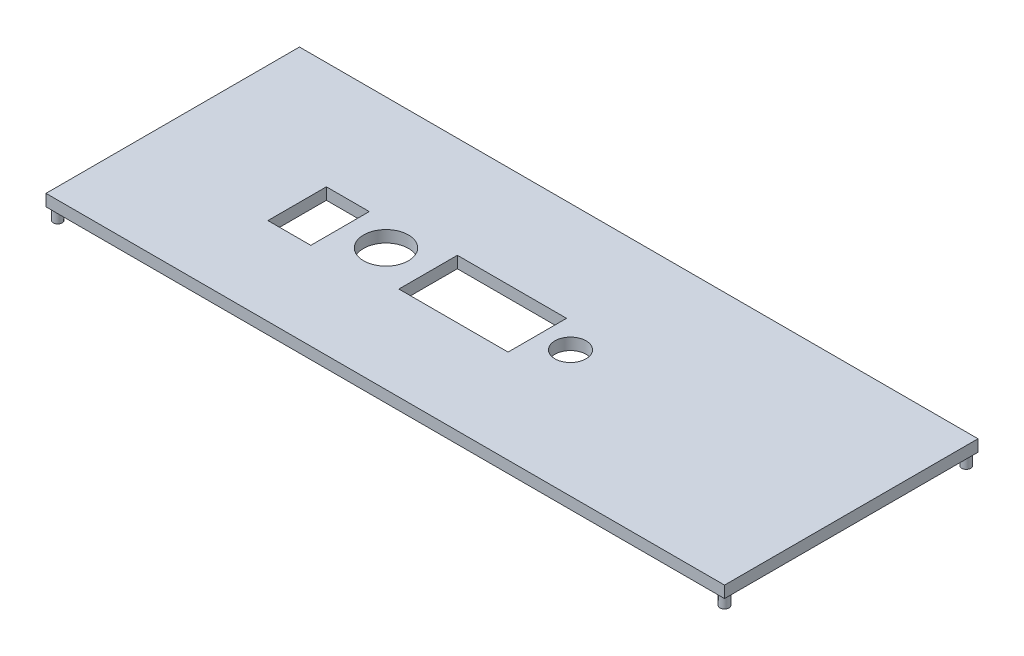
ISO-10303-21;
HEADER;
FILE_DESCRIPTION(('STEP AP214'),'2;1');
FILE_NAME('part.step','',(''),(''),'','','');
FILE_SCHEMA(('AUTOMOTIVE_DESIGN { 1 0 10303 214 1 1 1 1 }'));
ENDSEC;
DATA;
#1=APPLICATION_CONTEXT('core data for automotive mechanical design processes');
#2=APPLICATION_PROTOCOL_DEFINITION('international standard','automotive_design',2000,#1);
#3=PRODUCT_CONTEXT('',#1,'mechanical');
#4=PRODUCT('Part','Part','',(#3));
#5=PRODUCT_RELATED_PRODUCT_CATEGORY('part','',(#4));
#6=PRODUCT_DEFINITION_FORMATION('','',#4);
#7=PRODUCT_DEFINITION_CONTEXT('part definition',#1,'design');
#8=PRODUCT_DEFINITION('design','',#6,#7);
#9=PRODUCT_DEFINITION_SHAPE('','',#8);
#10=(LENGTH_UNIT() NAMED_UNIT(*) SI_UNIT(.MILLI.,.METRE.));
#11=(NAMED_UNIT(*) PLANE_ANGLE_UNIT() SI_UNIT($,.RADIAN.));
#12=(NAMED_UNIT(*) SI_UNIT($,.STERADIAN.) SOLID_ANGLE_UNIT());
#13=UNCERTAINTY_MEASURE_WITH_UNIT(LENGTH_MEASURE(1.E-05),#10,'distance_accuracy_value','');
#14=(GEOMETRIC_REPRESENTATION_CONTEXT(3) GLOBAL_UNCERTAINTY_ASSIGNED_CONTEXT((#13)) GLOBAL_UNIT_ASSIGNED_CONTEXT((#10,
#11,#12)) REPRESENTATION_CONTEXT('',''));
#15=CARTESIAN_POINT('',(0.,0.,0.));
#16=DIRECTION('',(0.,0.,1.));
#17=DIRECTION('',(1.,0.,0.));
#18=AXIS2_PLACEMENT_3D('',#15,#16,#17);
#19=CARTESIAN_POINT('',(87.,3.,32.5));
#20=DIRECTION('',(-1.,0.,0.));
#21=DIRECTION('',(0.,0.,1.));
#22=AXIS2_PLACEMENT_3D('',#19,#20,#21);
#23=PLANE('',#22);
#24=DIRECTION('',(0.,0.,-1.));
#25=VECTOR('',#24,1.);
#26=CARTESIAN_POINT('',(87.,0.,32.5));
#27=LINE('',#26,#25);
#28=CARTESIAN_POINT('',(87.,0.,32.5));
#29=VERTEX_POINT('',#28);
#30=CARTESIAN_POINT('',(87.,0.,-32.5));
#31=VERTEX_POINT('',#30);
#32=EDGE_CURVE('E248',#29,#31,#27,.T.);
#33=ORIENTED_EDGE('',*,*,#32,.T.);
#34=DIRECTION('',(0.,-1.,0.));
#35=VECTOR('',#34,1.);
#36=CARTESIAN_POINT('',(87.,3.,-32.5));
#37=LINE('',#36,#35);
#38=CARTESIAN_POINT('',(87.,3.,-32.5));
#39=VERTEX_POINT('',#38);
#40=EDGE_CURVE('E11',#39,#31,#37,.T.);
#41=ORIENTED_EDGE('',*,*,#40,.F.);
#42=DIRECTION('',(0.,0.,-1.));
#43=VECTOR('',#42,1.);
#44=CARTESIAN_POINT('',(87.,3.,32.5));
#45=LINE('',#44,#43);
#46=CARTESIAN_POINT('',(87.,3.,32.5));
#47=VERTEX_POINT('',#46);
#48=EDGE_CURVE('E233',#47,#39,#45,.T.);
#49=ORIENTED_EDGE('',*,*,#48,.F.);
#50=DIRECTION('',(0.,-1.,0.));
#51=VECTOR('',#50,1.);
#52=CARTESIAN_POINT('',(87.,3.,32.5));
#53=LINE('',#52,#51);
#54=EDGE_CURVE('E247',#47,#29,#53,.T.);
#55=ORIENTED_EDGE('',*,*,#54,.T.);
#56=EDGE_LOOP('',(#33,#41,#49,#55));
#57=FACE_BOUND('',#56,.T.);
#58=ADVANCED_FACE('F39',(#57),#23,.F.);
#59=CARTESIAN_POINT('',(-87.,3.,-32.5));
#60=DIRECTION('',(0.,0.,1.));
#61=DIRECTION('',(1.,0.,0.));
#62=AXIS2_PLACEMENT_3D('',#59,#60,#61);
#63=PLANE('',#62);
#64=DIRECTION('',(-1.,0.,0.));
#65=VECTOR('',#64,1.);
#66=CARTESIAN_POINT('',(-87.,0.,-32.5));
#67=LINE('',#66,#65);
#68=CARTESIAN_POINT('',(-87.,0.,-32.5));
#69=VERTEX_POINT('',#68);
#70=EDGE_CURVE('E252',#31,#69,#67,.T.);
#71=ORIENTED_EDGE('',*,*,#70,.T.);
#72=DIRECTION('',(0.,-1.,0.));
#73=VECTOR('',#72,1.);
#74=CARTESIAN_POINT('',(-87.,3.,-32.5));
#75=LINE('',#74,#73);
#76=CARTESIAN_POINT('',(-87.,3.,-32.5));
#77=VERTEX_POINT('',#76);
#78=EDGE_CURVE('E47',#77,#69,#75,.T.);
#79=ORIENTED_EDGE('',*,*,#78,.F.);
#80=DIRECTION('',(-1.,0.,0.));
#81=VECTOR('',#80,1.);
#82=CARTESIAN_POINT('',(-87.,3.,-32.5));
#83=LINE('',#82,#81);
#84=EDGE_CURVE('E237',#39,#77,#83,.T.);
#85=ORIENTED_EDGE('',*,*,#84,.F.);
#86=ORIENTED_EDGE('',*,*,#40,.T.);
#87=EDGE_LOOP('',(#71,#79,#85,#86));
#88=FACE_BOUND('',#87,.T.);
#89=ADVANCED_FACE('F288',(#88),#63,.F.);
#90=CARTESIAN_POINT('',(-87.,3.,32.5));
#91=DIRECTION('',(1.,0.,0.));
#92=DIRECTION('',(0.,0.,-1.));
#93=AXIS2_PLACEMENT_3D('',#90,#91,#92);
#94=PLANE('',#93);
#95=DIRECTION('',(0.,0.,1.));
#96=VECTOR('',#95,1.);
#97=CARTESIAN_POINT('',(-87.,0.,32.5));
#98=LINE('',#97,#96);
#99=CARTESIAN_POINT('',(-87.,0.,32.5));
#100=VERTEX_POINT('',#99);
#101=EDGE_CURVE('E256',#69,#100,#98,.T.);
#102=ORIENTED_EDGE('',*,*,#101,.T.);
#103=DIRECTION('',(0.,-1.,0.));
#104=VECTOR('',#103,1.);
#105=CARTESIAN_POINT('',(-87.,3.,32.5));
#106=LINE('',#105,#104);
#107=CARTESIAN_POINT('',(-87.,3.,32.5));
#108=VERTEX_POINT('',#107);
#109=EDGE_CURVE('E264',#108,#100,#106,.T.);
#110=ORIENTED_EDGE('',*,*,#109,.F.);
#111=DIRECTION('',(0.,0.,1.));
#112=VECTOR('',#111,1.);
#113=CARTESIAN_POINT('',(-87.,3.,32.5));
#114=LINE('',#113,#112);
#115=EDGE_CURVE('E241',#77,#108,#114,.T.);
#116=ORIENTED_EDGE('',*,*,#115,.F.);
#117=ORIENTED_EDGE('',*,*,#78,.T.);
#118=EDGE_LOOP('',(#102,#110,#116,#117));
#119=FACE_BOUND('',#118,.T.);
#120=ADVANCED_FACE('F273',(#119),#94,.F.);
#121=CARTESIAN_POINT('',(-87.,3.,32.5));
#122=DIRECTION('',(0.,0.,-1.));
#123=DIRECTION('',(-1.,0.,0.));
#124=AXIS2_PLACEMENT_3D('',#121,#122,#123);
#125=PLANE('',#124);
#126=DIRECTION('',(1.,0.,0.));
#127=VECTOR('',#126,1.);
#128=CARTESIAN_POINT('',(-87.,0.,32.5));
#129=LINE('',#128,#127);
#130=EDGE_CURVE('E238',#100,#29,#129,.T.);
#131=ORIENTED_EDGE('',*,*,#130,.T.);
#132=ORIENTED_EDGE('',*,*,#54,.F.);
#133=DIRECTION('',(1.,0.,0.));
#134=VECTOR('',#133,1.);
#135=CARTESIAN_POINT('',(-87.,3.,32.5));
#136=LINE('',#135,#134);
#137=EDGE_CURVE('E244',#108,#47,#136,.T.);
#138=ORIENTED_EDGE('',*,*,#137,.F.);
#139=ORIENTED_EDGE('',*,*,#109,.T.);
#140=EDGE_LOOP('',(#131,#132,#138,#139));
#141=FACE_BOUND('',#140,.T.);
#142=ADVANCED_FACE('F281',(#141),#125,.F.);
#143=CARTESIAN_POINT('',(0.,3.,0.));
#144=DIRECTION('',(0.,-1.,0.));
#145=DIRECTION('',(0.,0.,-1.));
#146=AXIS2_PLACEMENT_3D('',#143,#144,#145);
#147=PLANE('',#146);
#148=CARTESIAN_POINT('',(15.,3.,0.));
#149=DIRECTION('',(0.,1.,0.));
#150=DIRECTION('',(0.,0.,1.));
#151=AXIS2_PLACEMENT_3D('',#148,#149,#150);
#152=CIRCLE('',#151,4.);
#153=CARTESIAN_POINT('',(15.,3.,4.));
#154=VERTEX_POINT('',#153);
#155=EDGE_CURVE('E159',#154,#154,#152,.T.);
#156=ORIENTED_EDGE('',*,*,#155,.F.);
#157=EDGE_LOOP('',(#156));
#158=FACE_BOUND('',#157,.T.);
#159=DIRECTION('',(-1.,0.,0.));
#160=VECTOR('',#159,1.);
#161=CARTESIAN_POINT('',(-20.5,3.,-6.49042405989809));
#162=LINE('',#161,#160);
#163=CARTESIAN_POINT('',(7.49999999999999,3.,-6.49042405989809));
#164=VERTEX_POINT('',#163);
#165=CARTESIAN_POINT('',(-20.5,3.,-6.49042405989809));
#166=VERTEX_POINT('',#165);
#167=EDGE_CURVE('E168',#164,#166,#162,.T.);
#168=ORIENTED_EDGE('',*,*,#167,.F.);
#169=DIRECTION('',(0.,0.,-1.));
#170=VECTOR('',#169,1.);
#171=CARTESIAN_POINT('',(7.49999999999999,3.,8.50957594010191));
#172=LINE('',#171,#170);
#173=CARTESIAN_POINT('',(7.49999999999999,3.,8.50957594010191));
#174=VERTEX_POINT('',#173);
#175=EDGE_CURVE('E54',#174,#164,#172,.T.);
#176=ORIENTED_EDGE('',*,*,#175,.F.);
#177=DIRECTION('',(1.,0.,0.));
#178=VECTOR('',#177,1.);
#179=CARTESIAN_POINT('',(-20.5,3.,8.50957594010191));
#180=LINE('',#179,#178);
#181=CARTESIAN_POINT('',(-20.5,3.,8.50957594010191));
#182=VERTEX_POINT('',#181);
#183=EDGE_CURVE('E152',#182,#174,#180,.T.);
#184=ORIENTED_EDGE('',*,*,#183,.F.);
#185=DIRECTION('',(0.,0.,1.));
#186=VECTOR('',#185,1.);
#187=CARTESIAN_POINT('',(-20.5,3.,8.50957594010191));
#188=LINE('',#187,#186);
#189=EDGE_CURVE('E156',#166,#182,#188,.T.);
#190=ORIENTED_EDGE('',*,*,#189,.F.);
#191=EDGE_LOOP('',(#168,#176,#184,#190));
#192=FACE_BOUND('',#191,.T.);
#193=CARTESIAN_POINT('',(-31.3,3.,1.00957594010191));
#194=DIRECTION('',(0.,1.,0.));
#195=DIRECTION('',(0.,0.,1.));
#196=AXIS2_PLACEMENT_3D('',#193,#194,#195);
#197=CIRCLE('',#196,5.75);
#198=CARTESIAN_POINT('',(-31.3,3.,6.75957594010191));
#199=VERTEX_POINT('',#198);
#200=EDGE_CURVE('E186',#199,#199,#197,.T.);
#201=ORIENTED_EDGE('',*,*,#200,.F.);
#202=EDGE_LOOP('',(#201));
#203=FACE_BOUND('',#202,.T.);
#204=DIRECTION('',(-1.,0.,0.));
#205=VECTOR('',#204,1.);
#206=CARTESIAN_POINT('',(-52.5,3.,-4.9039671170208));
#207=LINE('',#206,#205);
#208=CARTESIAN_POINT('',(-41.5,3.,-4.9039671170208));
#209=VERTEX_POINT('',#208);
#210=CARTESIAN_POINT('',(-52.5,3.,-4.9039671170208));
#211=VERTEX_POINT('',#210);
#212=EDGE_CURVE('E211',#209,#211,#207,.T.);
#213=ORIENTED_EDGE('',*,*,#212,.F.);
#214=DIRECTION('',(0.,0.,-1.));
#215=VECTOR('',#214,1.);
#216=CARTESIAN_POINT('',(-41.5,3.,-4.9039671170208));
#217=LINE('',#216,#215);
#218=CARTESIAN_POINT('',(-41.5,3.,10.0960328829792));
#219=VERTEX_POINT('',#218);
#220=EDGE_CURVE('E62',#219,#209,#217,.T.);
#221=ORIENTED_EDGE('',*,*,#220,.F.);
#222=DIRECTION('',(1.,0.,0.));
#223=VECTOR('',#222,1.);
#224=CARTESIAN_POINT('',(-52.5,3.,10.0960328829792));
#225=LINE('',#224,#223);
#226=CARTESIAN_POINT('',(-52.5,3.,10.0960328829792));
#227=VERTEX_POINT('',#226);
#228=EDGE_CURVE('E196',#227,#219,#225,.T.);
#229=ORIENTED_EDGE('',*,*,#228,.F.);
#230=DIRECTION('',(0.,0.,1.));
#231=VECTOR('',#230,1.);
#232=CARTESIAN_POINT('',(-52.5,3.,-4.9039671170208));
#233=LINE('',#232,#231);
#234=EDGE_CURVE('E216',#211,#227,#233,.T.);
#235=ORIENTED_EDGE('',*,*,#234,.F.);
#236=EDGE_LOOP('',(#213,#221,#229,#235));
#237=FACE_BOUND('',#236,.T.);
#238=ORIENTED_EDGE('',*,*,#48,.T.);
#239=ORIENTED_EDGE('',*,*,#84,.T.);
#240=ORIENTED_EDGE('',*,*,#115,.T.);
#241=ORIENTED_EDGE('',*,*,#137,.T.);
#242=EDGE_LOOP('',(#238,#239,#240,#241));
#243=FACE_BOUND('',#242,.T.);
#244=ADVANCED_FACE('F287',(#158,#192,#203,#237,#243),#147,.F.);
#245=CARTESIAN_POINT('',(0.,0.,0.));
#246=DIRECTION('',(0.,-1.,0.));
#247=DIRECTION('',(0.,0.,-1.));
#248=AXIS2_PLACEMENT_3D('',#245,#246,#247);
#249=PLANE('',#248);
#250=CARTESIAN_POINT('',(-85.4999999999993,0.,-31.));
#251=DIRECTION('',(0.,-1.,0.));
#252=DIRECTION('',(0.,0.,-1.));
#253=AXIS2_PLACEMENT_3D('',#250,#251,#252);
#254=CIRCLE('',#253,1.15);
#255=CARTESIAN_POINT('',(-85.4999999999993,0.,-32.15));
#256=VERTEX_POINT('',#255);
#257=EDGE_CURVE('E377',#256,#256,#254,.T.);
#258=ORIENTED_EDGE('',*,*,#257,.F.);
#259=EDGE_LOOP('',(#258));
#260=FACE_BOUND('',#259,.T.);
#261=CARTESIAN_POINT('',(85.5000000000007,0.,-31.));
#262=DIRECTION('',(0.,-1.,0.));
#263=DIRECTION('',(0.,0.,-1.));
#264=AXIS2_PLACEMENT_3D('',#261,#262,#263);
#265=CIRCLE('',#264,1.15);
#266=CARTESIAN_POINT('',(85.5000000000007,0.,-32.15));
#267=VERTEX_POINT('',#266);
#268=EDGE_CURVE('E376',#267,#267,#265,.T.);
#269=ORIENTED_EDGE('',*,*,#268,.F.);
#270=EDGE_LOOP('',(#269));
#271=FACE_BOUND('',#270,.T.);
#272=CARTESIAN_POINT('',(85.5,0.,31.));
#273=DIRECTION('',(0.,-1.,0.));
#274=DIRECTION('',(0.,0.,-1.));
#275=AXIS2_PLACEMENT_3D('',#272,#273,#274);
#276=CIRCLE('',#275,1.15);
#277=CARTESIAN_POINT('',(85.5,0.,29.85));
#278=VERTEX_POINT('',#277);
#279=EDGE_CURVE('E389',#278,#278,#276,.T.);
#280=ORIENTED_EDGE('',*,*,#279,.F.);
#281=EDGE_LOOP('',(#280));
#282=FACE_BOUND('',#281,.T.);
#283=CARTESIAN_POINT('',(-85.5,0.,31.));
#284=DIRECTION('',(0.,-1.,0.));
#285=DIRECTION('',(0.,0.,-1.));
#286=AXIS2_PLACEMENT_3D('',#283,#284,#285);
#287=CIRCLE('',#286,1.15);
#288=CARTESIAN_POINT('',(-85.5,0.,29.85));
#289=VERTEX_POINT('',#288);
#290=EDGE_CURVE('E395',#289,#289,#287,.T.);
#291=ORIENTED_EDGE('',*,*,#290,.F.);
#292=EDGE_LOOP('',(#291));
#293=FACE_BOUND('',#292,.T.);
#294=CARTESIAN_POINT('',(15.,0.,0.));
#295=DIRECTION('',(0.,1.,0.));
#296=DIRECTION('',(0.,0.,1.));
#297=AXIS2_PLACEMENT_3D('',#294,#295,#296);
#298=CIRCLE('',#297,4.);
#299=CARTESIAN_POINT('',(15.,0.,4.));
#300=VERTEX_POINT('',#299);
#301=EDGE_CURVE('E253',#300,#300,#298,.T.);
#302=ORIENTED_EDGE('',*,*,#301,.T.);
#303=EDGE_LOOP('',(#302));
#304=FACE_BOUND('',#303,.T.);
#305=DIRECTION('',(0.,0.,-1.));
#306=VECTOR('',#305,1.);
#307=CARTESIAN_POINT('',(7.49999999999999,0.,8.50957594010191));
#308=LINE('',#307,#306);
#309=CARTESIAN_POINT('',(7.49999999999999,0.,8.50957594010191));
#310=VERTEX_POINT('',#309);
#311=CARTESIAN_POINT('',(7.49999999999999,0.,-6.49042405989809));
#312=VERTEX_POINT('',#311);
#313=EDGE_CURVE('E130',#310,#312,#308,.T.);
#314=ORIENTED_EDGE('',*,*,#313,.T.);
#315=DIRECTION('',(-1.,0.,0.));
#316=VECTOR('',#315,1.);
#317=CARTESIAN_POINT('',(-20.5,0.,-6.49042405989809));
#318=LINE('',#317,#316);
#319=CARTESIAN_POINT('',(-20.5,0.,-6.49042405989809));
#320=VERTEX_POINT('',#319);
#321=EDGE_CURVE('E141',#312,#320,#318,.T.);
#322=ORIENTED_EDGE('',*,*,#321,.T.);
#323=DIRECTION('',(0.,0.,1.));
#324=VECTOR('',#323,1.);
#325=CARTESIAN_POINT('',(-20.5,0.,8.50957594010191));
#326=LINE('',#325,#324);
#327=CARTESIAN_POINT('',(-20.5,0.,8.50957594010191));
#328=VERTEX_POINT('',#327);
#329=EDGE_CURVE('E146',#320,#328,#326,.T.);
#330=ORIENTED_EDGE('',*,*,#329,.T.);
#331=DIRECTION('',(1.,0.,0.));
#332=VECTOR('',#331,1.);
#333=CARTESIAN_POINT('',(-20.5,0.,8.50957594010191));
#334=LINE('',#333,#332);
#335=EDGE_CURVE('E137',#328,#310,#334,.T.);
#336=ORIENTED_EDGE('',*,*,#335,.T.);
#337=EDGE_LOOP('',(#314,#322,#330,#336));
#338=FACE_BOUND('',#337,.T.);
#339=CARTESIAN_POINT('',(-31.3,0.,1.00957594010191));
#340=DIRECTION('',(0.,1.,0.));
#341=DIRECTION('',(0.,0.,1.));
#342=AXIS2_PLACEMENT_3D('',#339,#340,#341);
#343=CIRCLE('',#342,5.75);
#344=CARTESIAN_POINT('',(-31.3,0.,6.75957594010191));
#345=VERTEX_POINT('',#344);
#346=EDGE_CURVE('E169',#345,#345,#343,.T.);
#347=ORIENTED_EDGE('',*,*,#346,.T.);
#348=EDGE_LOOP('',(#347));
#349=FACE_BOUND('',#348,.T.);
#350=DIRECTION('',(0.,0.,-1.));
#351=VECTOR('',#350,1.);
#352=CARTESIAN_POINT('',(-41.5,0.,-4.9039671170208));
#353=LINE('',#352,#351);
#354=CARTESIAN_POINT('',(-41.5,0.,10.0960328829792));
#355=VERTEX_POINT('',#354);
#356=CARTESIAN_POINT('',(-41.5,0.,-4.9039671170208));
#357=VERTEX_POINT('',#356);
#358=EDGE_CURVE('E191',#355,#357,#353,.T.);
#359=ORIENTED_EDGE('',*,*,#358,.T.);
#360=DIRECTION('',(-1.,0.,0.));
#361=VECTOR('',#360,1.);
#362=CARTESIAN_POINT('',(-52.5,0.,-4.9039671170208));
#363=LINE('',#362,#361);
#364=CARTESIAN_POINT('',(-52.5,0.,-4.9039671170208));
#365=VERTEX_POINT('',#364);
#366=EDGE_CURVE('E195',#357,#365,#363,.T.);
#367=ORIENTED_EDGE('',*,*,#366,.T.);
#368=DIRECTION('',(0.,0.,1.));
#369=VECTOR('',#368,1.);
#370=CARTESIAN_POINT('',(-52.5,0.,-4.9039671170208));
#371=LINE('',#370,#369);
#372=CARTESIAN_POINT('',(-52.5,0.,10.0960328829792));
#373=VERTEX_POINT('',#372);
#374=EDGE_CURVE('E200',#365,#373,#371,.T.);
#375=ORIENTED_EDGE('',*,*,#374,.T.);
#376=DIRECTION('',(1.,0.,0.));
#377=VECTOR('',#376,1.);
#378=CARTESIAN_POINT('',(-52.5,0.,10.0960328829792));
#379=LINE('',#378,#377);
#380=EDGE_CURVE('E204',#373,#355,#379,.T.);
#381=ORIENTED_EDGE('',*,*,#380,.T.);
#382=EDGE_LOOP('',(#359,#367,#375,#381));
#383=FACE_BOUND('',#382,.T.);
#384=ORIENTED_EDGE('',*,*,#32,.F.);
#385=ORIENTED_EDGE('',*,*,#130,.F.);
#386=ORIENTED_EDGE('',*,*,#101,.F.);
#387=ORIENTED_EDGE('',*,*,#70,.F.);
#388=EDGE_LOOP('',(#384,#385,#386,#387));
#389=FACE_BOUND('',#388,.T.);
#390=ADVANCED_FACE('F148',(#260,#271,#282,#293,#304,#338,#349,#383,#389),#249,.T.);
#391=CARTESIAN_POINT('',(-41.5,0.,-4.9039671170208));
#392=DIRECTION('',(1.,0.,0.));
#393=DIRECTION('',(0.,0.,-1.));
#394=AXIS2_PLACEMENT_3D('',#391,#392,#393);
#395=PLANE('',#394);
#396=ORIENTED_EDGE('',*,*,#220,.T.);
#397=DIRECTION('',(0.,1.,0.));
#398=VECTOR('',#397,1.);
#399=CARTESIAN_POINT('',(-41.5,0.,-4.9039671170208));
#400=LINE('',#399,#398);
#401=EDGE_CURVE('E208',#357,#209,#400,.T.);
#402=ORIENTED_EDGE('',*,*,#401,.F.);
#403=ORIENTED_EDGE('',*,*,#358,.F.);
#404=DIRECTION('',(0.,1.,0.));
#405=VECTOR('',#404,1.);
#406=CARTESIAN_POINT('',(-41.5,0.,10.0960328829792));
#407=LINE('',#406,#405);
#408=EDGE_CURVE('E190',#355,#219,#407,.T.);
#409=ORIENTED_EDGE('',*,*,#408,.T.);
#410=EDGE_LOOP('',(#396,#402,#403,#409));
#411=FACE_BOUND('',#410,.T.);
#412=ADVANCED_FACE('F300',(#411),#395,.F.);
#413=CARTESIAN_POINT('',(-52.5,0.,10.0960328829792));
#414=DIRECTION('',(0.,0.,1.));
#415=DIRECTION('',(1.,0.,0.));
#416=AXIS2_PLACEMENT_3D('',#413,#414,#415);
#417=PLANE('',#416);
#418=ORIENTED_EDGE('',*,*,#228,.T.);
#419=ORIENTED_EDGE('',*,*,#408,.F.);
#420=ORIENTED_EDGE('',*,*,#380,.F.);
#421=DIRECTION('',(0.,1.,0.));
#422=VECTOR('',#421,1.);
#423=CARTESIAN_POINT('',(-52.5,0.,10.0960328829792));
#424=LINE('',#423,#422);
#425=EDGE_CURVE('E225',#373,#227,#424,.T.);
#426=ORIENTED_EDGE('',*,*,#425,.T.);
#427=EDGE_LOOP('',(#418,#419,#420,#426));
#428=FACE_BOUND('',#427,.T.);
#429=ADVANCED_FACE('F307',(#428),#417,.F.);
#430=CARTESIAN_POINT('',(-52.5,0.,-4.9039671170208));
#431=DIRECTION('',(-1.,0.,0.));
#432=DIRECTION('',(0.,0.,1.));
#433=AXIS2_PLACEMENT_3D('',#430,#431,#432);
#434=PLANE('',#433);
#435=ORIENTED_EDGE('',*,*,#234,.T.);
#436=ORIENTED_EDGE('',*,*,#425,.F.);
#437=ORIENTED_EDGE('',*,*,#374,.F.);
#438=DIRECTION('',(0.,1.,0.));
#439=VECTOR('',#438,1.);
#440=CARTESIAN_POINT('',(-52.5,0.,-4.9039671170208));
#441=LINE('',#440,#439);
#442=EDGE_CURVE('E228',#365,#211,#441,.T.);
#443=ORIENTED_EDGE('',*,*,#442,.T.);
#444=EDGE_LOOP('',(#435,#436,#437,#443));
#445=FACE_BOUND('',#444,.T.);
#446=ADVANCED_FACE('F312',(#445),#434,.F.);
#447=CARTESIAN_POINT('',(-52.5,0.,-4.9039671170208));
#448=DIRECTION('',(0.,0.,-1.));
#449=DIRECTION('',(-1.,0.,0.));
#450=AXIS2_PLACEMENT_3D('',#447,#448,#449);
#451=PLANE('',#450);
#452=ORIENTED_EDGE('',*,*,#212,.T.);
#453=ORIENTED_EDGE('',*,*,#442,.F.);
#454=ORIENTED_EDGE('',*,*,#366,.F.);
#455=ORIENTED_EDGE('',*,*,#401,.T.);
#456=EDGE_LOOP('',(#452,#453,#454,#455));
#457=FACE_BOUND('',#456,.T.);
#458=ADVANCED_FACE('F308',(#457),#451,.F.);
#459=CARTESIAN_POINT('',(-31.3,0.,1.00957594010191));
#460=DIRECTION('',(0.,1.,0.));
#461=DIRECTION('',(0.,0.,1.));
#462=AXIS2_PLACEMENT_3D('',#459,#460,#461);
#463=CYLINDRICAL_SURFACE('',#462,5.75);
#464=ORIENTED_EDGE('',*,*,#346,.F.);
#465=EDGE_LOOP('',(#464));
#466=FACE_BOUND('',#465,.T.);
#467=ORIENTED_EDGE('',*,*,#200,.T.);
#468=EDGE_LOOP('',(#467));
#469=FACE_BOUND('',#468,.T.);
#470=ADVANCED_FACE('F311',(#466,#469),#463,.F.);
#471=CARTESIAN_POINT('',(7.49999999999999,0.,8.50957594010191));
#472=DIRECTION('',(1.,0.,0.));
#473=DIRECTION('',(0.,0.,-1.));
#474=AXIS2_PLACEMENT_3D('',#471,#472,#473);
#475=PLANE('',#474);
#476=ORIENTED_EDGE('',*,*,#175,.T.);
#477=DIRECTION('',(0.,1.,0.));
#478=VECTOR('',#477,1.);
#479=CARTESIAN_POINT('',(7.49999999999999,0.,-6.49042405989809));
#480=LINE('',#479,#478);
#481=EDGE_CURVE('E126',#312,#164,#480,.T.);
#482=ORIENTED_EDGE('',*,*,#481,.F.);
#483=ORIENTED_EDGE('',*,*,#313,.F.);
#484=DIRECTION('',(0.,1.,0.));
#485=VECTOR('',#484,1.);
#486=CARTESIAN_POINT('',(7.49999999999999,0.,8.50957594010191));
#487=LINE('',#486,#485);
#488=EDGE_CURVE('E175',#310,#174,#487,.T.);
#489=ORIENTED_EDGE('',*,*,#488,.T.);
#490=EDGE_LOOP('',(#476,#482,#483,#489));
#491=FACE_BOUND('',#490,.T.);
#492=ADVANCED_FACE('F128',(#491),#475,.F.);
#493=CARTESIAN_POINT('',(-20.5,0.,8.50957594010191));
#494=DIRECTION('',(0.,0.,1.));
#495=DIRECTION('',(1.,0.,0.));
#496=AXIS2_PLACEMENT_3D('',#493,#494,#495);
#497=PLANE('',#496);
#498=ORIENTED_EDGE('',*,*,#183,.T.);
#499=ORIENTED_EDGE('',*,*,#488,.F.);
#500=ORIENTED_EDGE('',*,*,#335,.F.);
#501=DIRECTION('',(0.,1.,0.));
#502=VECTOR('',#501,1.);
#503=CARTESIAN_POINT('',(-20.5,0.,8.50957594010191));
#504=LINE('',#503,#502);
#505=EDGE_CURVE('E178',#328,#182,#504,.T.);
#506=ORIENTED_EDGE('',*,*,#505,.T.);
#507=EDGE_LOOP('',(#498,#499,#500,#506));
#508=FACE_BOUND('',#507,.T.);
#509=ADVANCED_FACE('F325',(#508),#497,.F.);
#510=CARTESIAN_POINT('',(-20.5,0.,8.50957594010191));
#511=DIRECTION('',(-1.,0.,0.));
#512=DIRECTION('',(0.,0.,1.));
#513=AXIS2_PLACEMENT_3D('',#510,#511,#512);
#514=PLANE('',#513);
#515=ORIENTED_EDGE('',*,*,#189,.T.);
#516=ORIENTED_EDGE('',*,*,#505,.F.);
#517=ORIENTED_EDGE('',*,*,#329,.F.);
#518=DIRECTION('',(0.,1.,0.));
#519=VECTOR('',#518,1.);
#520=CARTESIAN_POINT('',(-20.5,0.,-6.49042405989809));
#521=LINE('',#520,#519);
#522=EDGE_CURVE('E136',#320,#166,#521,.T.);
#523=ORIENTED_EDGE('',*,*,#522,.T.);
#524=EDGE_LOOP('',(#515,#516,#517,#523));
#525=FACE_BOUND('',#524,.T.);
#526=ADVANCED_FACE('F329',(#525),#514,.F.);
#527=CARTESIAN_POINT('',(-20.5,0.,-6.49042405989809));
#528=DIRECTION('',(0.,0.,-1.));
#529=DIRECTION('',(-1.,0.,0.));
#530=AXIS2_PLACEMENT_3D('',#527,#528,#529);
#531=PLANE('',#530);
#532=ORIENTED_EDGE('',*,*,#167,.T.);
#533=ORIENTED_EDGE('',*,*,#522,.F.);
#534=ORIENTED_EDGE('',*,*,#321,.F.);
#535=ORIENTED_EDGE('',*,*,#481,.T.);
#536=EDGE_LOOP('',(#532,#533,#534,#535));
#537=FACE_BOUND('',#536,.T.);
#538=ADVANCED_FACE('F142',(#537),#531,.F.);
#539=CARTESIAN_POINT('',(15.,0.,0.));
#540=DIRECTION('',(0.,1.,0.));
#541=DIRECTION('',(0.,0.,1.));
#542=AXIS2_PLACEMENT_3D('',#539,#540,#541);
#543=CYLINDRICAL_SURFACE('',#542,4.);
#544=ORIENTED_EDGE('',*,*,#301,.F.);
#545=EDGE_LOOP('',(#544));
#546=FACE_BOUND('',#545,.T.);
#547=ORIENTED_EDGE('',*,*,#155,.T.);
#548=EDGE_LOOP('',(#547));
#549=FACE_BOUND('',#548,.T.);
#550=ADVANCED_FACE('F328',(#546,#549),#543,.F.);
#551=CARTESIAN_POINT('',(-85.5,-3.,31.));
#552=DIRECTION('',(0.,1.,0.));
#553=DIRECTION('',(0.,0.,1.));
#554=AXIS2_PLACEMENT_3D('',#551,#552,#553);
#555=CYLINDRICAL_SURFACE('',#554,1.15);
#556=CARTESIAN_POINT('',(-85.5,-3.,31.));
#557=DIRECTION('',(0.,-1.,0.));
#558=DIRECTION('',(0.,0.,-1.));
#559=AXIS2_PLACEMENT_3D('',#556,#557,#558);
#560=CIRCLE('',#559,1.15);
#561=CARTESIAN_POINT('',(-85.5,-3.,29.85));
#562=VERTEX_POINT('',#561);
#563=EDGE_CURVE('E212',#562,#562,#560,.T.);
#564=ORIENTED_EDGE('',*,*,#563,.F.);
#565=EDGE_LOOP('',(#564));
#566=FACE_BOUND('',#565,.T.);
#567=ORIENTED_EDGE('',*,*,#290,.T.);
#568=EDGE_LOOP('',(#567));
#569=FACE_BOUND('',#568,.T.);
#570=ADVANCED_FACE('F338',(#566,#569),#555,.T.);
#571=CARTESIAN_POINT('',(-85.5,-3.,31.));
#572=DIRECTION('',(0.,-1.,0.));
#573=DIRECTION('',(0.,0.,-1.));
#574=AXIS2_PLACEMENT_3D('',#571,#572,#573);
#575=PLANE('',#574);
#576=ORIENTED_EDGE('',*,*,#563,.T.);
#577=EDGE_LOOP('',(#576));
#578=FACE_BOUND('',#577,.T.);
#579=ADVANCED_FACE('F342',(#578),#575,.T.);
#580=CARTESIAN_POINT('',(85.5,-3.,31.));
#581=DIRECTION('',(0.,1.,0.));
#582=DIRECTION('',(0.,0.,1.));
#583=AXIS2_PLACEMENT_3D('',#580,#581,#582);
#584=CYLINDRICAL_SURFACE('',#583,1.15);
#585=CARTESIAN_POINT('',(85.5,-3.,31.));
#586=DIRECTION('',(0.,-1.,0.));
#587=DIRECTION('',(0.,0.,-1.));
#588=AXIS2_PLACEMENT_3D('',#585,#586,#587);
#589=CIRCLE('',#588,1.15);
#590=CARTESIAN_POINT('',(85.5,-3.,29.85));
#591=VERTEX_POINT('',#590);
#592=EDGE_CURVE('E391',#591,#591,#589,.T.);
#593=ORIENTED_EDGE('',*,*,#592,.F.);
#594=EDGE_LOOP('',(#593));
#595=FACE_BOUND('',#594,.T.);
#596=ORIENTED_EDGE('',*,*,#279,.T.);
#597=EDGE_LOOP('',(#596));
#598=FACE_BOUND('',#597,.T.);
#599=ADVANCED_FACE('F346',(#595,#598),#584,.T.);
#600=CARTESIAN_POINT('',(85.5,-3.,31.));
#601=DIRECTION('',(0.,-1.,0.));
#602=DIRECTION('',(0.,0.,-1.));
#603=AXIS2_PLACEMENT_3D('',#600,#601,#602);
#604=PLANE('',#603);
#605=ORIENTED_EDGE('',*,*,#592,.T.);
#606=EDGE_LOOP('',(#605));
#607=FACE_BOUND('',#606,.T.);
#608=ADVANCED_FACE('F350',(#607),#604,.T.);
#609=CARTESIAN_POINT('',(85.5000000000007,-3.,-31.));
#610=DIRECTION('',(0.,1.,0.));
#611=DIRECTION('',(0.,0.,1.));
#612=AXIS2_PLACEMENT_3D('',#609,#610,#611);
#613=CYLINDRICAL_SURFACE('',#612,1.15);
#614=CARTESIAN_POINT('',(85.5000000000007,-3.,-31.));
#615=DIRECTION('',(0.,-1.,0.));
#616=DIRECTION('',(0.,0.,-1.));
#617=AXIS2_PLACEMENT_3D('',#614,#615,#616);
#618=CIRCLE('',#617,1.15);
#619=CARTESIAN_POINT('',(85.5000000000007,-3.,-32.15));
#620=VERTEX_POINT('',#619);
#621=EDGE_CURVE('E382',#620,#620,#618,.T.);
#622=ORIENTED_EDGE('',*,*,#621,.F.);
#623=EDGE_LOOP('',(#622));
#624=FACE_BOUND('',#623,.T.);
#625=ORIENTED_EDGE('',*,*,#268,.T.);
#626=EDGE_LOOP('',(#625));
#627=FACE_BOUND('',#626,.T.);
#628=ADVANCED_FACE('F354',(#624,#627),#613,.T.);
#629=CARTESIAN_POINT('',(85.5000000000007,-3.,-31.));
#630=DIRECTION('',(0.,-1.,0.));
#631=DIRECTION('',(0.,0.,-1.));
#632=AXIS2_PLACEMENT_3D('',#629,#630,#631);
#633=PLANE('',#632);
#634=ORIENTED_EDGE('',*,*,#621,.T.);
#635=EDGE_LOOP('',(#634));
#636=FACE_BOUND('',#635,.T.);
#637=ADVANCED_FACE('F358',(#636),#633,.T.);
#638=CARTESIAN_POINT('',(-85.4999999999993,-3.,-31.));
#639=DIRECTION('',(0.,1.,0.));
#640=DIRECTION('',(0.,0.,1.));
#641=AXIS2_PLACEMENT_3D('',#638,#639,#640);
#642=CYLINDRICAL_SURFACE('',#641,1.15);
#643=CARTESIAN_POINT('',(-85.4999999999993,-3.,-31.));
#644=DIRECTION('',(0.,-1.,0.));
#645=DIRECTION('',(0.,0.,-1.));
#646=AXIS2_PLACEMENT_3D('',#643,#644,#645);
#647=CIRCLE('',#646,1.15);
#648=CARTESIAN_POINT('',(-85.4999999999993,-3.,-32.15));
#649=VERTEX_POINT('',#648);
#650=EDGE_CURVE('E374',#649,#649,#647,.T.);
#651=ORIENTED_EDGE('',*,*,#650,.F.);
#652=EDGE_LOOP('',(#651));
#653=FACE_BOUND('',#652,.T.);
#654=ORIENTED_EDGE('',*,*,#257,.T.);
#655=EDGE_LOOP('',(#654));
#656=FACE_BOUND('',#655,.T.);
#657=ADVANCED_FACE('F362',(#653,#656),#642,.T.);
#658=CARTESIAN_POINT('',(-85.4999999999993,-3.,-31.));
#659=DIRECTION('',(0.,-1.,0.));
#660=DIRECTION('',(0.,0.,-1.));
#661=AXIS2_PLACEMENT_3D('',#658,#659,#660);
#662=PLANE('',#661);
#663=ORIENTED_EDGE('',*,*,#650,.T.);
#664=EDGE_LOOP('',(#663));
#665=FACE_BOUND('',#664,.T.);
#666=ADVANCED_FACE('F366',(#665),#662,.T.);
#667=CLOSED_SHELL('',(#58,#89,#120,#142,#244,#390,#412,#429,#446,#458,#470,#492,#509,#526,#538,
#550,#570,#579,#599,#608,#628,#637,#657,#666));
#668=MANIFOLD_SOLID_BREP('B2',#667);
#669=ADVANCED_BREP_SHAPE_REPRESENTATION('',(#18,#668),#14);
#670=SHAPE_DEFINITION_REPRESENTATION(#9,#669);
ENDSEC;
END-ISO-10303-21;
